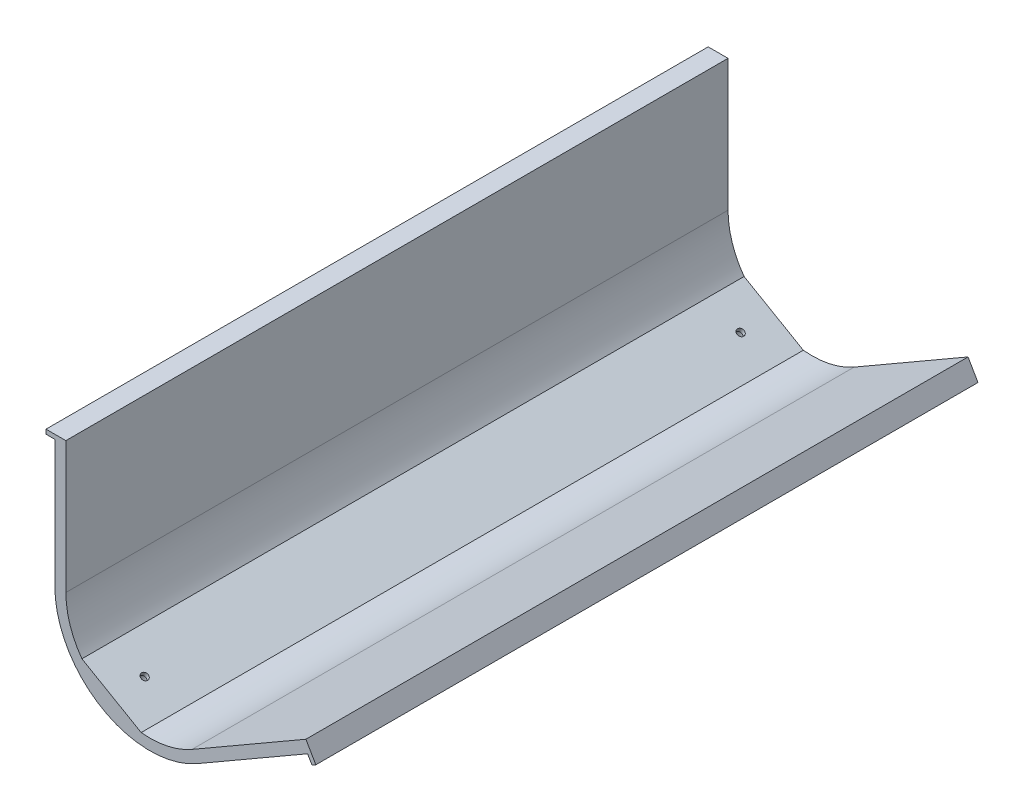
ISO-10303-21;
HEADER;
FILE_DESCRIPTION(('STEP AP214'),'2;1');
FILE_NAME('part.step','',(''),(''),'','','');
FILE_SCHEMA(('AUTOMOTIVE_DESIGN { 1 0 10303 214 1 1 1 1 }'));
ENDSEC;
DATA;
#1=APPLICATION_CONTEXT('core data for automotive mechanical design processes');
#2=APPLICATION_PROTOCOL_DEFINITION('international standard','automotive_design',2000,#1);
#3=PRODUCT_CONTEXT('',#1,'mechanical');
#4=PRODUCT('Part','Part','',(#3));
#5=PRODUCT_RELATED_PRODUCT_CATEGORY('part','',(#4));
#6=PRODUCT_DEFINITION_FORMATION('','',#4);
#7=PRODUCT_DEFINITION_CONTEXT('part definition',#1,'design');
#8=PRODUCT_DEFINITION('design','',#6,#7);
#9=PRODUCT_DEFINITION_SHAPE('','',#8);
#10=(LENGTH_UNIT() NAMED_UNIT(*) SI_UNIT(.MILLI.,.METRE.));
#11=(NAMED_UNIT(*) PLANE_ANGLE_UNIT() SI_UNIT($,.RADIAN.));
#12=(NAMED_UNIT(*) SI_UNIT($,.STERADIAN.) SOLID_ANGLE_UNIT());
#13=UNCERTAINTY_MEASURE_WITH_UNIT(LENGTH_MEASURE(1.E-05),#10,'distance_accuracy_value','');
#14=(GEOMETRIC_REPRESENTATION_CONTEXT(3) GLOBAL_UNCERTAINTY_ASSIGNED_CONTEXT((#13)) GLOBAL_UNIT_ASSIGNED_CONTEXT((#10,
#11,#12)) REPRESENTATION_CONTEXT('',''));
#15=CARTESIAN_POINT('',(0.,0.,0.));
#16=DIRECTION('',(0.,0.,1.));
#17=DIRECTION('',(1.,0.,0.));
#18=AXIS2_PLACEMENT_3D('',#15,#16,#17);
#19=CARTESIAN_POINT('',(33.0940107675842,0.,459.654933865598));
#20=DIRECTION('',(0.,0.,-1.));
#21=DIRECTION('',(-1.,0.,0.));
#22=AXIS2_PLACEMENT_3D('',#19,#20,#21);
#23=CYLINDRICAL_SURFACE('',#22,43.0940107675849);
#24=CARTESIAN_POINT('',(9.10518694657025,-35.799861671815,285.));
#25=CARTESIAN_POINT('',(9.10519244447353,-35.7998663266525,285.161297097093));
#26=CARTESIAN_POINT('',(9.11652316812617,-35.8074659248552,285.32270657392));
#27=CARTESIAN_POINT('',(9.16159802631115,-35.8376072181925,285.641066985922));
#28=CARTESIAN_POINT('',(9.19536812511742,-35.8601662225764,285.798012536322));
#29=CARTESIAN_POINT('',(9.28445875797792,-35.9193797442514,286.102787623212));
#30=CARTESIAN_POINT('',(9.33976776572867,-35.9560267223882,286.250621986524));
#31=CARTESIAN_POINT('',(9.47051911939522,-36.0420657217431,286.533038598448));
#32=CARTESIAN_POINT('',(9.54595691016941,-36.0914548593282,286.667623835914));
#33=CARTESIAN_POINT('',(9.71517680704267,-36.2012989670421,286.919987804878));
#34=CARTESIAN_POINT('',(9.80898618631744,-36.2617703804664,287.037741093674));
#35=CARTESIAN_POINT('',(10.0124622146195,-36.3916256307078,287.252880651108));
#36=CARTESIAN_POINT('',(10.1221295302732,-36.461009842182,287.350266063111));
#37=CARTESIAN_POINT('',(10.3545529188578,-36.6064147399901,287.521984909403));
#38=CARTESIAN_POINT('',(10.4773209078901,-36.6824414566216,287.596297112449));
#39=CARTESIAN_POINT('',(10.7325708372993,-36.838595646703,287.719624183307));
#40=CARTESIAN_POINT('',(10.8650526618639,-36.9187230712592,287.768639352663));
#41=CARTESIAN_POINT('',(11.1358908755815,-37.0804471556159,287.839909905808));
#42=CARTESIAN_POINT('',(11.2742381381263,-37.1620414267307,287.862205389749));
#43=CARTESIAN_POINT('',(11.5531171456246,-37.3243847083736,287.879527544094));
#44=CARTESIAN_POINT('',(11.6936488630598,-37.4051337295281,287.874554557732));
#45=CARTESIAN_POINT('',(11.9726571680676,-37.5633847751024,287.837513961301));
#46=CARTESIAN_POINT('',(12.1111366703706,-37.6408917624794,287.805489483915));
#47=CARTESIAN_POINT('',(12.3822568887193,-37.790753149233,287.715321921167));
#48=CARTESIAN_POINT('',(12.5148975664079,-37.8631075147624,287.657178664252));
#49=CARTESIAN_POINT('',(12.770543071781,-38.0009414950658,287.516375312336));
#50=CARTESIAN_POINT('',(12.8935401343535,-38.0664155839331,287.433695711658));
#51=CARTESIAN_POINT('',(13.1261155043288,-38.1889280804036,287.246180826693));
#52=CARTESIAN_POINT('',(13.2356936389436,-38.245966379386,287.141345257165));
#53=CARTESIAN_POINT('',(13.4383180949122,-38.3504962395822,286.912250817473));
#54=CARTESIAN_POINT('',(13.5313317908603,-38.3979689840718,286.787954502241));
#55=CARTESIAN_POINT('',(13.6977027205264,-38.4822780645245,286.523597950881));
#56=CARTESIAN_POINT('',(13.7710599451993,-38.5191143955932,286.383537707497));
#57=CARTESIAN_POINT('',(13.8958314683849,-38.5814536328349,286.091604706992));
#58=CARTESIAN_POINT('',(13.947244297232,-38.6069557799368,285.939731159511));
#59=CARTESIAN_POINT('',(14.0264906761579,-38.6461565118039,285.628493952112));
#60=CARTESIAN_POINT('',(14.0543245425335,-38.6598552549044,285.469130392698));
#61=CARTESIAN_POINT('',(14.0854935222108,-38.6751902858889,285.147765620562));
#62=CARTESIAN_POINT('',(14.088875733929,-38.67684976365,284.98577008139));
#63=CARTESIAN_POINT('',(14.0711577931146,-38.6681383367068,284.663450885273));
#64=CARTESIAN_POINT('',(14.0500577860039,-38.6577675034614,284.503127218403));
#65=CARTESIAN_POINT('',(13.984079768996,-38.6251943536176,284.188851302327));
#66=CARTESIAN_POINT('',(13.9392234513303,-38.603002830556,284.034893378508));
#67=CARTESIAN_POINT('',(13.8271632725371,-38.5471950603565,283.737543984934));
#68=CARTESIAN_POINT('',(13.7599591805395,-38.513578695191,283.59415262436));
#69=CARTESIAN_POINT('',(13.6051804337481,-38.435488196064,283.321766254255));
#70=CARTESIAN_POINT('',(13.5175748194409,-38.3909975551453,283.192793569926));
#71=CARTESIAN_POINT('',(13.3247482749117,-38.2920583983756,282.953130642489));
#72=CARTESIAN_POINT('',(13.21952714891,-38.2376097718503,282.842440602601));
#73=CARTESIAN_POINT('',(12.9944859369292,-38.1197978883274,282.642307773289));
#74=CARTESIAN_POINT('',(12.8746429974715,-38.0564206516239,282.552898906233));
#75=CARTESIAN_POINT('',(12.6240935984965,-37.9222417957547,282.398098649762));
#76=CARTESIAN_POINT('',(12.4933872135474,-37.8514402275497,282.332707095504));
#77=CARTESIAN_POINT('',(12.2251004680357,-37.704187082144,282.227856563488));
#78=CARTESIAN_POINT('',(12.0875258759193,-37.6277402212668,282.188376205066));
#79=CARTESIAN_POINT('',(11.8094260598235,-37.4711311969166,282.136398812612));
#80=CARTESIAN_POINT('',(11.6689008696931,-37.390969076052,282.123901469203));
#81=CARTESIAN_POINT('',(11.3892147817137,-37.2293115097064,282.126247952406));
#82=CARTESIAN_POINT('',(11.2500517644559,-37.1478189557116,282.141038732099));
#83=CARTESIAN_POINT('',(10.9767234348156,-36.9857353685124,282.197431503953));
#84=CARTESIAN_POINT('',(10.8425581309257,-36.9051443368402,282.239033541672));
#85=CARTESIAN_POINT('',(10.5829137161413,-36.7473451089797,282.347855622046));
#86=CARTESIAN_POINT('',(10.4574344813431,-36.6701368645429,282.415075299187));
#87=CARTESIAN_POINT('',(10.2185290308157,-36.5215814556957,282.573217511789));
#88=CARTESIAN_POINT('',(10.1051025246018,-36.4502341500393,282.664139475816));
#89=CARTESIAN_POINT('',(9.89308124331671,-36.3156503243752,282.867302345702));
#90=CARTESIAN_POINT('',(9.79451391062923,-36.2524288423668,282.979581851251));
#91=CARTESIAN_POINT('',(9.61498881558282,-36.1364186011862,283.222215969229));
#92=CARTESIAN_POINT('',(9.5340353602606,-36.0836323939894,283.352574989824));
#93=CARTESIAN_POINT('',(9.39174688472133,-35.9903281847304,283.627835036746));
#94=CARTESIAN_POINT('',(9.33043853945913,-35.9498268675561,283.772755487625));
#95=CARTESIAN_POINT('',(9.22920909909171,-35.8827079355814,284.072779367351));
#96=CARTESIAN_POINT('',(9.18926303646849,-35.8560741138832,284.227870669685));
#97=CARTESIAN_POINT('',(9.14210261175095,-35.8245769595269,284.48658744668));
#98=CARTESIAN_POINT('',(9.12827546427715,-35.8153238252842,284.588541978836));
#99=CARTESIAN_POINT('',(9.10981588029737,-35.8029646972843,284.793649007773));
#100=CARTESIAN_POINT('',(9.10518342899079,-35.7998586936321,284.896801502625));
#101=CARTESIAN_POINT('',(9.10518694657025,-35.799861671815,285.));
#102=B_SPLINE_CURVE_WITH_KNOTS('',3,(#24,#25,#26,#27,#28,#29,#30,#31,#32,#33,#34,#35,#36,#37,
#38,#39,#40,#41,#42,#43,#44,#45,#46,#47,#48,#49,#50,#51,#52,#53,#54,#55,#56,#57,#58,#59,#60,#61,
#62,#63,#64,#65,#66,#67,#68,#69,#70,#71,#72,#73,#74,#75,#76,#77,#78,#79,#80,#81,#82,#83,#84,#85,
#86,#87,#88,#89,#90,#91,#92,#93,#94,#95,#96,#97,#98,#99,#100,#101),.UNSPECIFIED.,.T.,.F.,(4,2,2,
2,2,2,2,2,2,2,2,2,2,2,2,2,2,2,2,2,2,2,2,2,2,2,2,2,2,2,2,2,2,2,2,2,2,2,4),(0.,0.483514542357615,
0.967589528847677,1.45140582327215,1.935112722839,2.41954321885344,2.90399408498874,
3.38888941544184,3.87377896570989,4.3579398924167,4.84209472492526,5.32547904302915,
5.80886653616381,6.29263934239359,6.77641837723653,7.26113997387421,7.74586179356263,
8.23061607107052,8.71536384580417,9.19917765713678,9.68298859467953,10.1663585171958,
10.6497334334575,11.1338467116872,11.6179653707357,12.1028506270876,12.5877325553981,
13.0722138779189,13.556689645543,14.0402246056368,14.5237603873553,15.0072892701854,
15.4908064967615,15.9752060374027,16.4597238931478,16.9448968867766,17.4295015802977,
17.7388565249918,18.0482109717202),.UNSPECIFIED.);
#103=CARTESIAN_POINT('',(9.10518694657025,-35.799861671815,285.));
#104=VERTEX_POINT('',#103);
#105=EDGE_CURVE('E37',#104,#104,#102,.T.);
#106=ORIENTED_EDGE('',*,*,#105,.T.);
#107=EDGE_LOOP('',(#106));
#108=FACE_BOUND('',#107,.T.);
#109=CARTESIAN_POINT('',(9.10518694657026,-35.799861671815,15.));
#110=CARTESIAN_POINT('',(9.10519244447353,-35.7998663266525,15.1612970970931));
#111=CARTESIAN_POINT('',(9.11652316812617,-35.8074659248552,15.3227065739202));
#112=CARTESIAN_POINT('',(9.16159802631115,-35.8376072181925,15.6410669859224));
#113=CARTESIAN_POINT('',(9.19536812511742,-35.8601662225764,15.7980125363219));
#114=CARTESIAN_POINT('',(9.28445875797792,-35.9193797442514,16.1027876232124));
#115=CARTESIAN_POINT('',(9.33976776572868,-35.9560267223882,16.2506219865244));
#116=CARTESIAN_POINT('',(9.47051911939522,-36.0420657217431,16.5330385984478));
#117=CARTESIAN_POINT('',(9.5459569101694,-36.0914548593282,16.6676238359136));
#118=CARTESIAN_POINT('',(9.71517680704266,-36.2012989670421,16.919987804878));
#119=CARTESIAN_POINT('',(9.80898618631743,-36.2617703804664,17.0377410936741));
#120=CARTESIAN_POINT('',(10.0124622146195,-36.3916256307078,17.2528806511076));
#121=CARTESIAN_POINT('',(10.1221295302732,-36.461009842182,17.3502660631113));
#122=CARTESIAN_POINT('',(10.3545529188578,-36.6064147399901,17.5219849094027));
#123=CARTESIAN_POINT('',(10.47732090789,-36.6824414566216,17.5962971124491));
#124=CARTESIAN_POINT('',(10.7325708372993,-36.8385956467031,17.7196241833065));
#125=CARTESIAN_POINT('',(10.865052661864,-36.9187230712592,17.7686393526634));
#126=CARTESIAN_POINT('',(11.1358908755815,-37.0804471556159,17.8399099058084));
#127=CARTESIAN_POINT('',(11.2742381381263,-37.1620414267307,17.862205389749));
#128=CARTESIAN_POINT('',(11.5531171456246,-37.3243847083736,17.8795275440942));
#129=CARTESIAN_POINT('',(11.6936488630598,-37.4051337295281,17.8745545577315));
#130=CARTESIAN_POINT('',(11.9726571680676,-37.5633847751024,17.8375139613011));
#131=CARTESIAN_POINT('',(12.1111366703706,-37.6408917624794,17.8054894839145));
#132=CARTESIAN_POINT('',(12.3822568887194,-37.790753149233,17.715321921167));
#133=CARTESIAN_POINT('',(12.5148975664079,-37.8631075147624,17.6571786642518));
#134=CARTESIAN_POINT('',(12.770543071781,-38.0009414950658,17.5163753123363));
#135=CARTESIAN_POINT('',(12.8935401343535,-38.0664155839331,17.4336957116579));
#136=CARTESIAN_POINT('',(13.1261155043288,-38.1889280804036,17.2461808266934));
#137=CARTESIAN_POINT('',(13.2356936389436,-38.245966379386,17.1413452571648));
#138=CARTESIAN_POINT('',(13.4383180949122,-38.3504962395822,16.9122508174725));
#139=CARTESIAN_POINT('',(13.5313317908603,-38.3979689840718,16.7879545022411));
#140=CARTESIAN_POINT('',(13.6977027205264,-38.4822780645245,16.5235979508806));
#141=CARTESIAN_POINT('',(13.7710599451993,-38.5191143955932,16.3835377074974));
#142=CARTESIAN_POINT('',(13.8958314683849,-38.5814536328349,16.0916047069917));
#143=CARTESIAN_POINT('',(13.947244297232,-38.6069557799368,15.9397311595107));
#144=CARTESIAN_POINT('',(14.0264906761579,-38.6461565118039,15.6284939521119));
#145=CARTESIAN_POINT('',(14.0543245425336,-38.6598552549044,15.4691303926981));
#146=CARTESIAN_POINT('',(14.0854935222109,-38.6751902858889,15.1477656205615));
#147=CARTESIAN_POINT('',(14.088875733929,-38.67684976365,14.9857700813894));
#148=CARTESIAN_POINT('',(14.0711577931146,-38.6681383367068,14.6634508852726));
#149=CARTESIAN_POINT('',(14.0500577860039,-38.6577675034614,14.5031272184029));
#150=CARTESIAN_POINT('',(13.984079768996,-38.6251943536176,14.1888513023271));
#151=CARTESIAN_POINT('',(13.9392234513303,-38.603002830556,14.0348933785076));
#152=CARTESIAN_POINT('',(13.8271632725371,-38.5471950603565,13.7375439849343));
#153=CARTESIAN_POINT('',(13.7599591805396,-38.513578695191,13.5941526243602));
#154=CARTESIAN_POINT('',(13.6051804337481,-38.435488196064,13.3217662542546));
#155=CARTESIAN_POINT('',(13.5175748194409,-38.3909975551453,13.1927935699264));
#156=CARTESIAN_POINT('',(13.3247482749118,-38.2920583983756,12.9531306424889));
#157=CARTESIAN_POINT('',(13.21952714891,-38.2376097718503,12.842440602601));
#158=CARTESIAN_POINT('',(12.9944859369292,-38.1197978883274,12.6423077732891));
#159=CARTESIAN_POINT('',(12.8746429974715,-38.0564206516239,12.5528989062334));
#160=CARTESIAN_POINT('',(12.6240935984965,-37.9222417957547,12.3980986497617));
#161=CARTESIAN_POINT('',(12.4933872135474,-37.8514402275497,12.3327070955044));
#162=CARTESIAN_POINT('',(12.2251004680357,-37.704187082144,12.2278565634881));
#163=CARTESIAN_POINT('',(12.0875258759193,-37.6277402212668,12.188376205066));
#164=CARTESIAN_POINT('',(11.8094260598235,-37.4711311969166,12.1363988126115));
#165=CARTESIAN_POINT('',(11.6689008696931,-37.390969076052,12.1239014692027));
#166=CARTESIAN_POINT('',(11.3892147817138,-37.2293115097064,12.1262479524056));
#167=CARTESIAN_POINT('',(11.2500517644559,-37.1478189557116,12.1410387320989));
#168=CARTESIAN_POINT('',(10.9767234348156,-36.9857353685124,12.1974315039533));
#169=CARTESIAN_POINT('',(10.8425581309257,-36.9051443368402,12.239033541672));
#170=CARTESIAN_POINT('',(10.5829137161413,-36.7473451089797,12.3478556220465));
#171=CARTESIAN_POINT('',(10.4574344813431,-36.6701368645429,12.4150752991866));
#172=CARTESIAN_POINT('',(10.2185290308158,-36.5215814556957,12.5732175117887));
#173=CARTESIAN_POINT('',(10.1051025246018,-36.4502341500393,12.6641394758155));
#174=CARTESIAN_POINT('',(9.89308124331672,-36.3156503243752,12.8673023457015));
#175=CARTESIAN_POINT('',(9.79451391062925,-36.2524288423668,12.9795818512506));
#176=CARTESIAN_POINT('',(9.61498881558284,-36.1364186011862,13.2222159692288));
#177=CARTESIAN_POINT('',(9.53403536026061,-36.0836323939894,13.3525749898236));
#178=CARTESIAN_POINT('',(9.39174688472133,-35.9903281847304,13.6278350367465));
#179=CARTESIAN_POINT('',(9.33043853945913,-35.9498268675561,13.7727554876249));
#180=CARTESIAN_POINT('',(9.22920909909171,-35.8827079355814,14.0727793673509));
#181=CARTESIAN_POINT('',(9.1892630364685,-35.8560741138833,14.2278706696853));
#182=CARTESIAN_POINT('',(9.14210261175095,-35.8245769595269,14.4865874466799));
#183=CARTESIAN_POINT('',(9.12827546427715,-35.8153238252842,14.5885419788358));
#184=CARTESIAN_POINT('',(9.10981588029738,-35.8029646972843,14.7936490077728));
#185=CARTESIAN_POINT('',(9.1051834289908,-35.7998586936321,14.8968015026252));
#186=CARTESIAN_POINT('',(9.10518694657026,-35.799861671815,15.));
#187=B_SPLINE_CURVE_WITH_KNOTS('',3,(#109,#110,#111,#112,#113,#114,#115,#116,#117,#118,#119,
#120,#121,#122,#123,#124,#125,#126,#127,#128,#129,#130,#131,#132,#133,#134,#135,#136,#137,#138,
#139,#140,#141,#142,#143,#144,#145,#146,#147,#148,#149,#150,#151,#152,#153,#154,#155,#156,#157,
#158,#159,#160,#161,#162,#163,#164,#165,#166,#167,#168,#169,#170,#171,#172,#173,#174,#175,#176,
#177,#178,#179,#180,#181,#182,#183,#184,#185,#186),.UNSPECIFIED.,.T.,.F.,(4,2,2,2,2,2,2,2,2,2,2,
2,2,2,2,2,2,2,2,2,2,2,2,2,2,2,2,2,2,2,2,2,2,2,2,2,2,2,4),(0.,0.483514542357623,
0.967589528847684,1.45140582327213,1.935112722839,2.41954321885344,2.90399408498871,
3.38888941544184,3.8737789657099,4.35793989241672,4.84209472492527,5.32547904302916,
5.80886653616383,6.29263934239359,6.77641837723654,7.26113997387425,7.74586179356267,
8.23061607107055,8.71536384580422,9.1991776571369,9.68298859467958,10.1663585171957,
10.6497334334575,11.1338467116872,11.6179653707357,12.1028506270876,12.5877325553981,
13.0722138779189,13.556689645543,14.0402246056368,14.5237603873553,15.0072892701854,
15.4908064967616,15.9752060374027,16.4597238931479,16.9448968867766,17.4295015802977,
17.7388565249918,18.0482109717202),.UNSPECIFIED.);
#188=CARTESIAN_POINT('',(9.10518694657026,-35.799861671815,15.));
#189=VERTEX_POINT('',#188);
#190=EDGE_CURVE('E234',#189,#189,#187,.T.);
#191=ORIENTED_EDGE('',*,*,#190,.T.);
#192=EDGE_LOOP('',(#191));
#193=FACE_BOUND('',#192,.T.);
#194=CARTESIAN_POINT('',(33.0940107675842,0.,300.));
#195=DIRECTION('',(0.,0.,1.));
#196=DIRECTION('',(1.,0.,0.));
#197=AXIS2_PLACEMENT_3D('',#194,#195,#196);
#198=CIRCLE('',#197,43.0940107675849);
#199=CARTESIAN_POINT('',(-10.0000000000007,0.,300.));
#200=VERTEX_POINT('',#199);
#201=CARTESIAN_POINT('',(54.6410161513771,-37.3205080756885,300.));
#202=VERTEX_POINT('',#201);
#203=EDGE_CURVE('E190',#200,#202,#198,.T.);
#204=ORIENTED_EDGE('',*,*,#203,.F.);
#205=DIRECTION('',(0.,0.,-1.));
#206=VECTOR('',#205,1.);
#207=CARTESIAN_POINT('',(-10.0000000000007,0.,459.654933865598));
#208=LINE('',#207,#206);
#209=CARTESIAN_POINT('',(-10.0000000000007,0.,0.));
#210=VERTEX_POINT('',#209);
#211=EDGE_CURVE('E53',#200,#210,#208,.T.);
#212=ORIENTED_EDGE('',*,*,#211,.T.);
#213=CARTESIAN_POINT('',(33.0940107675842,0.,0.));
#214=DIRECTION('',(0.,0.,1.));
#215=DIRECTION('',(1.,0.,0.));
#216=AXIS2_PLACEMENT_3D('',#213,#214,#215);
#217=CIRCLE('',#216,43.0940107675849);
#218=CARTESIAN_POINT('',(54.6410161513771,-37.3205080756885,0.));
#219=VERTEX_POINT('',#218);
#220=EDGE_CURVE('E198',#210,#219,#217,.T.);
#221=ORIENTED_EDGE('',*,*,#220,.T.);
#222=DIRECTION('',(0.,0.,-1.));
#223=VECTOR('',#222,1.);
#224=CARTESIAN_POINT('',(54.6410161513771,-37.3205080756885,459.654933865598));
#225=LINE('',#224,#223);
#226=EDGE_CURVE('E116',#202,#219,#225,.T.);
#227=ORIENTED_EDGE('',*,*,#226,.F.);
#228=EDGE_LOOP('',(#204,#212,#221,#227));
#229=FACE_BOUND('',#228,.T.);
#230=ADVANCED_FACE('F33',(#108,#193,#229),#23,.T.);
#231=CARTESIAN_POINT('',(54.6410161513771,-37.3205080756885,459.654933865598));
#232=DIRECTION('',(-0.500000000000016,0.866025403784429,0.));
#233=DIRECTION('',(-0.866025403784429,-0.500000000000016,0.));
#234=AXIS2_PLACEMENT_3D('',#231,#232,#233);
#235=PLANE('',#234);
#236=DIRECTION('',(0.866025403784429,0.500000000000016,0.));
#237=VECTOR('',#236,1.);
#238=CARTESIAN_POINT('',(54.6410161513771,-37.3205080756885,300.));
#239=LINE('',#238,#237);
#240=CARTESIAN_POINT('',(104.518010155129,-8.52401216125157,300.));
#241=VERTEX_POINT('',#240);
#242=EDGE_CURVE('E123',#202,#241,#239,.T.);
#243=ORIENTED_EDGE('',*,*,#242,.F.);
#244=ORIENTED_EDGE('',*,*,#226,.T.);
#245=DIRECTION('',(0.866025403784429,0.500000000000016,0.));
#246=VECTOR('',#245,1.);
#247=CARTESIAN_POINT('',(54.6410161513771,-37.3205080756885,0.));
#248=LINE('',#247,#246);
#249=CARTESIAN_POINT('',(104.518010155129,-8.52401216125157,0.));
#250=VERTEX_POINT('',#249);
#251=EDGE_CURVE('E197',#219,#250,#248,.T.);
#252=ORIENTED_EDGE('',*,*,#251,.T.);
#253=DIRECTION('',(0.,0.,-1.));
#254=VECTOR('',#253,1.);
#255=CARTESIAN_POINT('',(104.518010155129,-8.52401216125157,459.654933865598));
#256=LINE('',#255,#254);
#257=EDGE_CURVE('E199',#241,#250,#256,.T.);
#258=ORIENTED_EDGE('',*,*,#257,.F.);
#259=EDGE_LOOP('',(#243,#244,#252,#258));
#260=FACE_BOUND('',#259,.T.);
#261=ADVANCED_FACE('F304',(#260),#235,.F.);
#262=CARTESIAN_POINT('',(104.518010155129,-8.52401216125157,459.654933865598));
#263=DIRECTION('',(0.86602540378443,0.500000000000015,0.));
#264=DIRECTION('',(-0.500000000000015,0.86602540378443,0.));
#265=AXIS2_PLACEMENT_3D('',#262,#263,#264);
#266=PLANE('',#265);
#267=DIRECTION('',(0.500000000000015,-0.86602540378443,0.));
#268=VECTOR('',#267,1.);
#269=CARTESIAN_POINT('',(104.518010155129,-8.52401216125157,300.));
#270=LINE('',#269,#268);
#271=CARTESIAN_POINT('',(106.518010155129,-11.9881137763893,300.));
#272=VERTEX_POINT('',#271);
#273=EDGE_CURVE('E186',#241,#272,#270,.T.);
#274=ORIENTED_EDGE('',*,*,#273,.F.);
#275=ORIENTED_EDGE('',*,*,#257,.T.);
#276=DIRECTION('',(0.500000000000015,-0.86602540378443,0.));
#277=VECTOR('',#276,1.);
#278=CARTESIAN_POINT('',(104.518010155129,-8.52401216125157,0.));
#279=LINE('',#278,#277);
#280=CARTESIAN_POINT('',(106.518010155129,-11.9881137763893,0.));
#281=VERTEX_POINT('',#280);
#282=EDGE_CURVE('E201',#250,#281,#279,.T.);
#283=ORIENTED_EDGE('',*,*,#282,.T.);
#284=DIRECTION('',(0.,0.,-1.));
#285=VECTOR('',#284,1.);
#286=CARTESIAN_POINT('',(106.518010155129,-11.9881137763893,459.654933865598));
#287=LINE('',#286,#285);
#288=EDGE_CURVE('E202',#272,#281,#287,.T.);
#289=ORIENTED_EDGE('',*,*,#288,.F.);
#290=EDGE_LOOP('',(#274,#275,#283,#289));
#291=FACE_BOUND('',#290,.T.);
#292=ADVANCED_FACE('F301',(#291),#266,.F.);
#293=CARTESIAN_POINT('',(106.518010155129,-11.9881137763893,459.654933865598));
#294=DIRECTION('',(-0.500000000000012,0.866025403784432,0.));
#295=DIRECTION('',(-0.866025403784432,-0.500000000000012,0.));
#296=AXIS2_PLACEMENT_3D('',#293,#294,#295);
#297=PLANE('',#296);
#298=DIRECTION('',(0.866025403784432,0.500000000000012,0.));
#299=VECTOR('',#298,1.);
#300=CARTESIAN_POINT('',(106.518010155129,-11.9881137763893,300.));
#301=LINE('',#300,#299);
#302=CARTESIAN_POINT('',(108.250060962698,-10.9881137763893,300.));
#303=VERTEX_POINT('',#302);
#304=EDGE_CURVE('E183',#272,#303,#301,.T.);
#305=ORIENTED_EDGE('',*,*,#304,.F.);
#306=ORIENTED_EDGE('',*,*,#288,.T.);
#307=DIRECTION('',(0.866025403784432,0.500000000000012,0.));
#308=VECTOR('',#307,1.);
#309=CARTESIAN_POINT('',(106.518010155129,-11.9881137763893,0.));
#310=LINE('',#309,#308);
#311=CARTESIAN_POINT('',(108.250060962698,-10.9881137763893,0.));
#312=VERTEX_POINT('',#311);
#313=EDGE_CURVE('E204',#281,#312,#310,.T.);
#314=ORIENTED_EDGE('',*,*,#313,.T.);
#315=DIRECTION('',(0.,0.,-1.));
#316=VECTOR('',#315,1.);
#317=CARTESIAN_POINT('',(108.250060962698,-10.9881137763893,459.654933865598));
#318=LINE('',#317,#316);
#319=EDGE_CURVE('E205',#303,#312,#318,.T.);
#320=ORIENTED_EDGE('',*,*,#319,.F.);
#321=EDGE_LOOP('',(#305,#306,#314,#320));
#322=FACE_BOUND('',#321,.T.);
#323=ADVANCED_FACE('F297',(#322),#297,.F.);
#324=CARTESIAN_POINT('',(106.250060962698,-7.52401216125177,459.654933865598));
#325=DIRECTION('',(-0.866025403784432,-0.500000000000011,0.));
#326=DIRECTION('',(0.500000000000011,-0.866025403784432,0.));
#327=AXIS2_PLACEMENT_3D('',#324,#325,#326);
#328=PLANE('',#327);
#329=DIRECTION('',(-0.500000000000011,0.866025403784432,0.));
#330=VECTOR('',#329,1.);
#331=CARTESIAN_POINT('',(106.250060962698,-7.52401216125177,300.));
#332=LINE('',#331,#330);
#333=CARTESIAN_POINT('',(103.750060962698,-3.19388514232939,300.));
#334=VERTEX_POINT('',#333);
#335=EDGE_CURVE('E180',#303,#334,#332,.T.);
#336=ORIENTED_EDGE('',*,*,#335,.F.);
#337=ORIENTED_EDGE('',*,*,#319,.T.);
#338=DIRECTION('',(-0.500000000000011,0.866025403784432,0.));
#339=VECTOR('',#338,1.);
#340=CARTESIAN_POINT('',(106.250060962698,-7.52401216125177,0.));
#341=LINE('',#340,#339);
#342=CARTESIAN_POINT('',(103.750060962698,-3.19388514232939,0.));
#343=VERTEX_POINT('',#342);
#344=EDGE_CURVE('E207',#312,#343,#341,.T.);
#345=ORIENTED_EDGE('',*,*,#344,.T.);
#346=DIRECTION('',(0.,0.,-1.));
#347=VECTOR('',#346,1.);
#348=CARTESIAN_POINT('',(103.750060962698,-3.19388514232939,459.654933865598));
#349=LINE('',#348,#347);
#350=EDGE_CURVE('E208',#334,#343,#349,.T.);
#351=ORIENTED_EDGE('',*,*,#350,.F.);
#352=EDGE_LOOP('',(#336,#337,#345,#351));
#353=FACE_BOUND('',#352,.T.);
#354=ADVANCED_FACE('F293',(#353),#328,.F.);
#355=CARTESIAN_POINT('',(52.1410161513771,-32.9903810567663,459.654933865598));
#356=DIRECTION('',(0.500000000000015,-0.86602540378443,0.));
#357=DIRECTION('',(0.86602540378443,0.500000000000015,0.));
#358=AXIS2_PLACEMENT_3D('',#355,#356,#357);
#359=PLANE('',#358);
#360=DIRECTION('',(-0.86602540378443,-0.500000000000015,0.));
#361=VECTOR('',#360,1.);
#362=CARTESIAN_POINT('',(52.1410161513771,-32.9903810567663,300.));
#363=LINE('',#362,#361);
#364=CARTESIAN_POINT('',(52.1410161513771,-32.9903810567663,300.));
#365=VERTEX_POINT('',#364);
#366=EDGE_CURVE('E177',#334,#365,#363,.T.);
#367=ORIENTED_EDGE('',*,*,#366,.F.);
#368=ORIENTED_EDGE('',*,*,#350,.T.);
#369=DIRECTION('',(-0.86602540378443,-0.500000000000015,0.));
#370=VECTOR('',#369,1.);
#371=CARTESIAN_POINT('',(52.1410161513771,-32.9903810567663,0.));
#372=LINE('',#371,#370);
#373=CARTESIAN_POINT('',(52.1410161513771,-32.9903810567663,0.));
#374=VERTEX_POINT('',#373);
#375=EDGE_CURVE('E210',#343,#374,#372,.T.);
#376=ORIENTED_EDGE('',*,*,#375,.T.);
#377=DIRECTION('',(0.,0.,-1.));
#378=VECTOR('',#377,1.);
#379=CARTESIAN_POINT('',(52.1410161513771,-32.9903810567663,459.654933865598));
#380=LINE('',#379,#378);
#381=EDGE_CURVE('E211',#365,#374,#380,.T.);
#382=ORIENTED_EDGE('',*,*,#381,.F.);
#383=EDGE_LOOP('',(#367,#368,#376,#382));
#384=FACE_BOUND('',#383,.T.);
#385=ADVANCED_FACE('F289',(#384),#359,.F.);
#386=CARTESIAN_POINT('',(33.0940107675842,0.,459.654933865598));
#387=DIRECTION('',(0.,0.,-1.));
#388=DIRECTION('',(-1.,0.,0.));
#389=AXIS2_PLACEMENT_3D('',#386,#387,#388);
#390=CYLINDRICAL_SURFACE('',#389,38.0940107675849);
#391=CARTESIAN_POINT('',(33.0940107675842,0.,300.));
#392=DIRECTION('',(0.,0.,1.));
#393=DIRECTION('',(1.,0.,0.));
#394=AXIS2_PLACEMENT_3D('',#391,#392,#393);
#395=CIRCLE('',#394,38.0940107675849);
#396=CARTESIAN_POINT('',(29.1209151276498,-37.8862530134192,300.));
#397=VERTEX_POINT('',#396);
#398=EDGE_CURVE('E174',#365,#397,#395,.F.);
#399=ORIENTED_EDGE('',*,*,#398,.F.);
#400=ORIENTED_EDGE('',*,*,#381,.T.);
#401=CARTESIAN_POINT('',(33.0940107675842,0.,0.));
#402=DIRECTION('',(0.,0.,-1.));
#403=DIRECTION('',(1.,0.,0.));
#404=AXIS2_PLACEMENT_3D('',#401,#402,#403);
#405=CIRCLE('',#404,38.0940107675849);
#406=CARTESIAN_POINT('',(29.1209151276498,-37.8862530134192,0.));
#407=VERTEX_POINT('',#406);
#408=EDGE_CURVE('E213',#374,#407,#405,.T.);
#409=ORIENTED_EDGE('',*,*,#408,.T.);
#410=DIRECTION('',(0.,0.,-1.));
#411=VECTOR('',#410,1.);
#412=CARTESIAN_POINT('',(29.1209151276498,-37.8862530134192,459.654933865598));
#413=LINE('',#412,#411);
#414=EDGE_CURVE('E214',#397,#407,#413,.T.);
#415=ORIENTED_EDGE('',*,*,#414,.F.);
#416=EDGE_LOOP('',(#399,#400,#409,#415));
#417=FACE_BOUND('',#416,.T.);
#418=ADVANCED_FACE('F285',(#417),#390,.F.);
#419=CARTESIAN_POINT('',(2.27010102372575,-22.3839282625581,459.654933865598));
#420=DIRECTION('',(-0.499999999999999,-0.86602540378444,0.));
#421=DIRECTION('',(0.86602540378444,-0.499999999999999,0.));
#422=AXIS2_PLACEMENT_3D('',#419,#420,#421);
#423=PLANE('',#422);
#424=CARTESIAN_POINT('',(15.6955080756878,-30.1350906379887,285.));
#425=DIRECTION('',(0.499999999999999,0.866025403784439,0.));
#426=DIRECTION('',(0.866025403784439,-0.499999999999999,0.));
#427=AXIS2_PLACEMENT_3D('',#424,#425,#426);
#428=CIRCLE('',#427,1.60000000000001);
#429=CARTESIAN_POINT('',(17.0811487217429,-30.9350906379887,285.));
#430=VERTEX_POINT('',#429);
#431=EDGE_CURVE('E240',#430,#430,#428,.T.);
#432=ORIENTED_EDGE('',*,*,#431,.F.);
#433=EDGE_LOOP('',(#432));
#434=FACE_BOUND('',#433,.T.);
#435=CARTESIAN_POINT('',(15.6955080756878,-30.1350906379887,15.));
#436=DIRECTION('',(0.499999999999999,0.866025403784439,0.));
#437=DIRECTION('',(-0.866025403784439,0.499999999999999,0.));
#438=AXIS2_PLACEMENT_3D('',#435,#436,#437);
#439=CIRCLE('',#438,1.60000000000001);
#440=CARTESIAN_POINT('',(14.3098674296327,-29.3350906379887,15.));
#441=VERTEX_POINT('',#440);
#442=EDGE_CURVE('E230',#441,#441,#439,.T.);
#443=ORIENTED_EDGE('',*,*,#442,.F.);
#444=EDGE_LOOP('',(#443));
#445=FACE_BOUND('',#444,.T.);
#446=DIRECTION('',(-0.86602540378444,0.499999999999999,0.));
#447=VECTOR('',#446,1.);
#448=CARTESIAN_POINT('',(2.27010102372575,-22.3839282625581,300.));
#449=LINE('',#448,#447);
#450=CARTESIAN_POINT('',(2.27010102372574,-22.3839282625581,300.));
#451=VERTEX_POINT('',#450);
#452=EDGE_CURVE('E171',#397,#451,#449,.T.);
#453=ORIENTED_EDGE('',*,*,#452,.F.);
#454=ORIENTED_EDGE('',*,*,#414,.T.);
#455=DIRECTION('',(-0.86602540378444,0.499999999999999,0.));
#456=VECTOR('',#455,1.);
#457=CARTESIAN_POINT('',(2.27010102372575,-22.3839282625581,0.));
#458=LINE('',#457,#456);
#459=CARTESIAN_POINT('',(2.27010102372574,-22.3839282625581,0.));
#460=VERTEX_POINT('',#459);
#461=EDGE_CURVE('E216',#407,#460,#458,.T.);
#462=ORIENTED_EDGE('',*,*,#461,.T.);
#463=DIRECTION('',(0.,0.,-1.));
#464=VECTOR('',#463,1.);
#465=CARTESIAN_POINT('',(2.27010102372574,-22.3839282625581,459.654933865598));
#466=LINE('',#465,#464);
#467=EDGE_CURVE('E217',#451,#460,#466,.T.);
#468=ORIENTED_EDGE('',*,*,#467,.F.);
#469=EDGE_LOOP('',(#453,#454,#462,#468));
#470=FACE_BOUND('',#469,.T.);
#471=ADVANCED_FACE('F281',(#434,#445,#470),#423,.F.);
#472=CARTESIAN_POINT('',(33.0940107675842,0.,459.654933865598));
#473=DIRECTION('',(0.,0.,-1.));
#474=DIRECTION('',(-1.,0.,0.));
#475=AXIS2_PLACEMENT_3D('',#472,#473,#474);
#476=CYLINDRICAL_SURFACE('',#475,38.0940107675849);
#477=CARTESIAN_POINT('',(33.0940107675842,0.,300.));
#478=DIRECTION('',(0.,0.,1.));
#479=DIRECTION('',(1.,0.,0.));
#480=AXIS2_PLACEMENT_3D('',#477,#478,#479);
#481=CIRCLE('',#480,38.0940107675849);
#482=CARTESIAN_POINT('',(-5.00000000000073,0.,300.));
#483=VERTEX_POINT('',#482);
#484=EDGE_CURVE('E168',#451,#483,#481,.F.);
#485=ORIENTED_EDGE('',*,*,#484,.F.);
#486=ORIENTED_EDGE('',*,*,#467,.T.);
#487=CARTESIAN_POINT('',(33.0940107675842,0.,0.));
#488=DIRECTION('',(0.,0.,-1.));
#489=DIRECTION('',(1.,0.,0.));
#490=AXIS2_PLACEMENT_3D('',#487,#488,#489);
#491=CIRCLE('',#490,38.0940107675849);
#492=CARTESIAN_POINT('',(-5.00000000000073,0.,0.));
#493=VERTEX_POINT('',#492);
#494=EDGE_CURVE('E219',#460,#493,#491,.T.);
#495=ORIENTED_EDGE('',*,*,#494,.T.);
#496=DIRECTION('',(0.,0.,-1.));
#497=VECTOR('',#496,1.);
#498=CARTESIAN_POINT('',(-5.00000000000073,0.,459.654933865598));
#499=LINE('',#498,#497);
#500=EDGE_CURVE('E220',#483,#493,#499,.T.);
#501=ORIENTED_EDGE('',*,*,#500,.F.);
#502=EDGE_LOOP('',(#485,#486,#495,#501));
#503=FACE_BOUND('',#502,.T.);
#504=ADVANCED_FACE('F277',(#503),#476,.F.);
#505=CARTESIAN_POINT('',(-5.00000000000073,0.,459.654933865598));
#506=DIRECTION('',(-1.,0.,0.));
#507=DIRECTION('',(0.,-1.,0.));
#508=AXIS2_PLACEMENT_3D('',#505,#506,#507);
#509=PLANE('',#508);
#510=DIRECTION('',(0.,1.,0.));
#511=VECTOR('',#510,1.);
#512=CARTESIAN_POINT('',(-5.00000000000073,0.,300.));
#513=LINE('',#512,#511);
#514=CARTESIAN_POINT('',(-5.00000000000044,59.5929918288719,300.));
#515=VERTEX_POINT('',#514);
#516=EDGE_CURVE('E163',#483,#515,#513,.T.);
#517=ORIENTED_EDGE('',*,*,#516,.F.);
#518=ORIENTED_EDGE('',*,*,#500,.T.);
#519=DIRECTION('',(0.,1.,0.));
#520=VECTOR('',#519,1.);
#521=CARTESIAN_POINT('',(-5.00000000000073,0.,0.));
#522=LINE('',#521,#520);
#523=CARTESIAN_POINT('',(-5.00000000000044,59.5929918288719,0.));
#524=VERTEX_POINT('',#523);
#525=EDGE_CURVE('E222',#493,#524,#522,.T.);
#526=ORIENTED_EDGE('',*,*,#525,.T.);
#527=DIRECTION('',(0.,0.,-1.));
#528=VECTOR('',#527,1.);
#529=CARTESIAN_POINT('',(-5.00000000000044,59.5929918288719,459.654933865598));
#530=LINE('',#529,#528);
#531=EDGE_CURVE('E223',#515,#524,#530,.T.);
#532=ORIENTED_EDGE('',*,*,#531,.F.);
#533=EDGE_LOOP('',(#517,#518,#526,#532));
#534=FACE_BOUND('',#533,.T.);
#535=ADVANCED_FACE('F273',(#534),#509,.F.);
#536=CARTESIAN_POINT('',(-14.0000000000004,59.5929918288719,459.654933865598));
#537=DIRECTION('',(0.,-1.,0.));
#538=DIRECTION('',(0.,0.,-1.));
#539=AXIS2_PLACEMENT_3D('',#536,#537,#538);
#540=PLANE('',#539);
#541=DIRECTION('',(-1.,0.,0.));
#542=VECTOR('',#541,1.);
#543=CARTESIAN_POINT('',(-14.0000000000004,59.5929918288719,300.));
#544=LINE('',#543,#542);
#545=CARTESIAN_POINT('',(-14.0000000000004,59.5929918288719,300.));
#546=VERTEX_POINT('',#545);
#547=EDGE_CURVE('E161',#515,#546,#544,.T.);
#548=ORIENTED_EDGE('',*,*,#547,.F.);
#549=ORIENTED_EDGE('',*,*,#531,.T.);
#550=DIRECTION('',(-1.,0.,0.));
#551=VECTOR('',#550,1.);
#552=CARTESIAN_POINT('',(-14.0000000000004,59.5929918288719,0.));
#553=LINE('',#552,#551);
#554=CARTESIAN_POINT('',(-14.0000000000004,59.5929918288719,0.));
#555=VERTEX_POINT('',#554);
#556=EDGE_CURVE('E225',#524,#555,#553,.T.);
#557=ORIENTED_EDGE('',*,*,#556,.T.);
#558=DIRECTION('',(0.,0.,-1.));
#559=VECTOR('',#558,1.);
#560=CARTESIAN_POINT('',(-14.0000000000004,59.5929918288719,459.654933865598));
#561=LINE('',#560,#559);
#562=EDGE_CURVE('E226',#546,#555,#561,.T.);
#563=ORIENTED_EDGE('',*,*,#562,.F.);
#564=EDGE_LOOP('',(#548,#549,#557,#563));
#565=FACE_BOUND('',#564,.T.);
#566=ADVANCED_FACE('F270',(#565),#540,.F.);
#567=CARTESIAN_POINT('',(-14.0000000000004,57.592991828872,459.654933865598));
#568=DIRECTION('',(1.,0.,0.));
#569=DIRECTION('',(0.,0.,-1.));
#570=AXIS2_PLACEMENT_3D('',#567,#568,#569);
#571=PLANE('',#570);
#572=DIRECTION('',(0.,-1.,0.));
#573=VECTOR('',#572,1.);
#574=CARTESIAN_POINT('',(-14.0000000000004,57.592991828872,300.));
#575=LINE('',#574,#573);
#576=CARTESIAN_POINT('',(-14.0000000000004,57.592991828872,300.));
#577=VERTEX_POINT('',#576);
#578=EDGE_CURVE('E45',#546,#577,#575,.T.);
#579=ORIENTED_EDGE('',*,*,#578,.F.);
#580=ORIENTED_EDGE('',*,*,#562,.T.);
#581=DIRECTION('',(0.,-1.,0.));
#582=VECTOR('',#581,1.);
#583=CARTESIAN_POINT('',(-14.0000000000004,57.592991828872,0.));
#584=LINE('',#583,#582);
#585=CARTESIAN_POINT('',(-14.0000000000004,57.592991828872,0.));
#586=VERTEX_POINT('',#585);
#587=EDGE_CURVE('E155',#555,#586,#584,.T.);
#588=ORIENTED_EDGE('',*,*,#587,.T.);
#589=DIRECTION('',(0.,0.,-1.));
#590=VECTOR('',#589,1.);
#591=CARTESIAN_POINT('',(-14.0000000000004,57.592991828872,459.654933865598));
#592=LINE('',#591,#590);
#593=EDGE_CURVE('E146',#577,#586,#592,.T.);
#594=ORIENTED_EDGE('',*,*,#593,.F.);
#595=EDGE_LOOP('',(#579,#580,#588,#594));
#596=FACE_BOUND('',#595,.T.);
#597=ADVANCED_FACE('F152',(#596),#571,.F.);
#598=CARTESIAN_POINT('',(-10.0000000000004,57.592991828872,459.654933865598));
#599=DIRECTION('',(0.,1.,0.));
#600=DIRECTION('',(0.,0.,1.));
#601=AXIS2_PLACEMENT_3D('',#598,#599,#600);
#602=PLANE('',#601);
#603=DIRECTION('',(1.,0.,0.));
#604=VECTOR('',#603,1.);
#605=CARTESIAN_POINT('',(-10.0000000000004,57.592991828872,300.));
#606=LINE('',#605,#604);
#607=CARTESIAN_POINT('',(-10.0000000000004,57.592991828872,300.));
#608=VERTEX_POINT('',#607);
#609=EDGE_CURVE('E11',#577,#608,#606,.T.);
#610=ORIENTED_EDGE('',*,*,#609,.F.);
#611=ORIENTED_EDGE('',*,*,#593,.T.);
#612=DIRECTION('',(1.,0.,0.));
#613=VECTOR('',#612,1.);
#614=CARTESIAN_POINT('',(-10.0000000000004,57.592991828872,0.));
#615=LINE('',#614,#613);
#616=CARTESIAN_POINT('',(-10.0000000000004,57.592991828872,0.));
#617=VERTEX_POINT('',#616);
#618=EDGE_CURVE('E157',#586,#617,#615,.T.);
#619=ORIENTED_EDGE('',*,*,#618,.T.);
#620=DIRECTION('',(0.,0.,-1.));
#621=VECTOR('',#620,1.);
#622=CARTESIAN_POINT('',(-10.0000000000004,57.592991828872,459.654933865598));
#623=LINE('',#622,#621);
#624=EDGE_CURVE('E59',#608,#617,#623,.T.);
#625=ORIENTED_EDGE('',*,*,#624,.F.);
#626=EDGE_LOOP('',(#610,#611,#619,#625));
#627=FACE_BOUND('',#626,.T.);
#628=ADVANCED_FACE('F145',(#627),#602,.F.);
#629=CARTESIAN_POINT('',(-10.0000000000007,0.,459.654933865598));
#630=DIRECTION('',(1.,0.,0.));
#631=DIRECTION('',(0.,1.,0.));
#632=AXIS2_PLACEMENT_3D('',#629,#630,#631);
#633=PLANE('',#632);
#634=DIRECTION('',(0.,-1.,0.));
#635=VECTOR('',#634,1.);
#636=CARTESIAN_POINT('',(-10.0000000000007,0.,300.));
#637=LINE('',#636,#635);
#638=EDGE_CURVE('E193',#608,#200,#637,.T.);
#639=ORIENTED_EDGE('',*,*,#638,.F.);
#640=ORIENTED_EDGE('',*,*,#624,.T.);
#641=DIRECTION('',(0.,-1.,0.));
#642=VECTOR('',#641,1.);
#643=CARTESIAN_POINT('',(-10.0000000000007,0.,0.));
#644=LINE('',#643,#642);
#645=EDGE_CURVE('E195',#617,#210,#644,.T.);
#646=ORIENTED_EDGE('',*,*,#645,.T.);
#647=ORIENTED_EDGE('',*,*,#211,.F.);
#648=EDGE_LOOP('',(#639,#640,#646,#647));
#649=FACE_BOUND('',#648,.T.);
#650=ADVANCED_FACE('F262',(#649),#633,.F.);
#651=CARTESIAN_POINT('',(33.0940107675842,0.,0.));
#652=DIRECTION('',(0.,0.,1.));
#653=DIRECTION('',(1.,0.,0.));
#654=AXIS2_PLACEMENT_3D('',#651,#652,#653);
#655=PLANE('',#654);
#656=ORIENTED_EDGE('',*,*,#220,.F.);
#657=ORIENTED_EDGE('',*,*,#645,.F.);
#658=ORIENTED_EDGE('',*,*,#618,.F.);
#659=ORIENTED_EDGE('',*,*,#587,.F.);
#660=ORIENTED_EDGE('',*,*,#556,.F.);
#661=ORIENTED_EDGE('',*,*,#525,.F.);
#662=ORIENTED_EDGE('',*,*,#494,.F.);
#663=ORIENTED_EDGE('',*,*,#461,.F.);
#664=ORIENTED_EDGE('',*,*,#408,.F.);
#665=ORIENTED_EDGE('',*,*,#375,.F.);
#666=ORIENTED_EDGE('',*,*,#344,.F.);
#667=ORIENTED_EDGE('',*,*,#313,.F.);
#668=ORIENTED_EDGE('',*,*,#282,.F.);
#669=ORIENTED_EDGE('',*,*,#251,.F.);
#670=EDGE_LOOP('',(#656,#657,#658,#659,#660,#661,#662,#663,#664,#665,#666,#667,#668,#669));
#671=FACE_BOUND('',#670,.T.);
#672=ADVANCED_FACE('F259',(#671),#655,.F.);
#673=CARTESIAN_POINT('',(2.40511359340034,105.4,300.));
#674=DIRECTION('',(0.,0.,1.));
#675=DIRECTION('',(1.,0.,0.));
#676=AXIS2_PLACEMENT_3D('',#673,#674,#675);
#677=PLANE('',#676);
#678=ORIENTED_EDGE('',*,*,#638,.T.);
#679=ORIENTED_EDGE('',*,*,#203,.T.);
#680=ORIENTED_EDGE('',*,*,#242,.T.);
#681=ORIENTED_EDGE('',*,*,#273,.T.);
#682=ORIENTED_EDGE('',*,*,#304,.T.);
#683=ORIENTED_EDGE('',*,*,#335,.T.);
#684=ORIENTED_EDGE('',*,*,#366,.T.);
#685=ORIENTED_EDGE('',*,*,#398,.T.);
#686=ORIENTED_EDGE('',*,*,#452,.T.);
#687=ORIENTED_EDGE('',*,*,#484,.T.);
#688=ORIENTED_EDGE('',*,*,#516,.T.);
#689=ORIENTED_EDGE('',*,*,#547,.T.);
#690=ORIENTED_EDGE('',*,*,#578,.T.);
#691=ORIENTED_EDGE('',*,*,#609,.T.);
#692=EDGE_LOOP('',(#678,#679,#680,#681,#682,#683,#684,#685,#686,#687,#688,#689,#690,#691));
#693=FACE_BOUND('',#692,.T.);
#694=ADVANCED_FACE('F35',(#693),#677,.T.);
#695=CARTESIAN_POINT('',(2.66025403784381,-52.7128129211019,15.));
#696=DIRECTION('',(0.499999999999999,0.866025403784439,0.));
#697=DIRECTION('',(-0.866025403784439,0.499999999999999,0.));
#698=AXIS2_PLACEMENT_3D('',#695,#696,#697);
#699=CYLINDRICAL_SURFACE('',#698,1.60000000000001);
#700=CARTESIAN_POINT('',(14.6955080756878,-31.8671414455576,15.));
#701=DIRECTION('',(0.499999999999999,0.866025403784439,0.));
#702=DIRECTION('',(-0.866025403784439,0.499999999999999,0.));
#703=AXIS2_PLACEMENT_3D('',#700,#701,#702);
#704=CIRCLE('',#703,1.60000000000001);
#705=CARTESIAN_POINT('',(13.3098674296327,-31.0671414455575,15.));
#706=VERTEX_POINT('',#705);
#707=EDGE_CURVE('E231',#706,#706,#704,.F.);
#708=ORIENTED_EDGE('',*,*,#707,.T.);
#709=EDGE_LOOP('',(#708));
#710=FACE_BOUND('',#709,.T.);
#711=ORIENTED_EDGE('',*,*,#442,.T.);
#712=EDGE_LOOP('',(#711));
#713=FACE_BOUND('',#712,.T.);
#714=ADVANCED_FACE('F254',(#710,#713),#699,.F.);
#715=CARTESIAN_POINT('',(2.6602540378438,-52.7128129211019,285.));
#716=DIRECTION('',(0.499999999999999,0.866025403784439,0.));
#717=DIRECTION('',(-0.866025403784439,0.499999999999999,0.));
#718=AXIS2_PLACEMENT_3D('',#715,#716,#717);
#719=CYLINDRICAL_SURFACE('',#718,1.60000000000001);
#720=CARTESIAN_POINT('',(14.6955080756878,-31.8671414455575,285.));
#721=DIRECTION('',(0.499999999999999,0.866025403784439,0.));
#722=DIRECTION('',(-0.866025403784439,0.499999999999999,0.));
#723=AXIS2_PLACEMENT_3D('',#720,#721,#722);
#724=CIRCLE('',#723,1.60000000000001);
#725=CARTESIAN_POINT('',(13.3098674296327,-31.0671414455575,285.));
#726=VERTEX_POINT('',#725);
#727=EDGE_CURVE('E241',#726,#726,#724,.F.);
#728=ORIENTED_EDGE('',*,*,#727,.T.);
#729=EDGE_LOOP('',(#728));
#730=FACE_BOUND('',#729,.T.);
#731=ORIENTED_EDGE('',*,*,#431,.T.);
#732=EDGE_LOOP('',(#731));
#733=FACE_BOUND('',#732,.T.);
#734=ADVANCED_FACE('F250',(#730,#733),#719,.F.);
#735=CARTESIAN_POINT('',(2.66025403784381,-52.7128129211019,15.));
#736=DIRECTION('',(0.499999999999999,0.866025403784439,0.));
#737=DIRECTION('',(-0.866025403784439,0.499999999999999,0.));
#738=AXIS2_PLACEMENT_3D('',#735,#736,#737);
#739=CYLINDRICAL_SURFACE('',#738,2.875);
#740=CARTESIAN_POINT('',(14.6955080756878,-31.8671414455576,15.));
#741=DIRECTION('',(0.499999999999999,0.866025403784439,0.));
#742=DIRECTION('',(-0.866025403784439,0.499999999999999,0.));
#743=AXIS2_PLACEMENT_3D('',#740,#741,#742);
#744=CIRCLE('',#743,2.875);
#745=CARTESIAN_POINT('',(12.2056850398075,-30.4296414455576,15.));
#746=VERTEX_POINT('',#745);
#747=EDGE_CURVE('E235',#746,#746,#744,.T.);
#748=ORIENTED_EDGE('',*,*,#747,.T.);
#749=EDGE_LOOP('',(#748));
#750=FACE_BOUND('',#749,.T.);
#751=ORIENTED_EDGE('',*,*,#190,.F.);
#752=EDGE_LOOP('',(#751));
#753=FACE_BOUND('',#752,.T.);
#754=ADVANCED_FACE('F244',(#750,#753),#739,.F.);
#755=CARTESIAN_POINT('',(14.6955080756878,-31.8671414455576,15.));
#756=DIRECTION('',(0.499999999999999,0.866025403784439,0.));
#757=DIRECTION('',(-0.866025403784439,0.499999999999999,0.));
#758=AXIS2_PLACEMENT_3D('',#755,#756,#757);
#759=PLANE('',#758);
#760=ORIENTED_EDGE('',*,*,#747,.F.);
#761=EDGE_LOOP('',(#760));
#762=FACE_BOUND('',#761,.T.);
#763=ORIENTED_EDGE('',*,*,#707,.F.);
#764=EDGE_LOOP('',(#763));
#765=FACE_BOUND('',#764,.T.);
#766=ADVANCED_FACE('F249',(#762,#765),#759,.F.);
#767=CARTESIAN_POINT('',(2.6602540378438,-52.7128129211019,285.));
#768=DIRECTION('',(0.499999999999999,0.866025403784439,0.));
#769=DIRECTION('',(-0.866025403784439,0.499999999999999,0.));
#770=AXIS2_PLACEMENT_3D('',#767,#768,#769);
#771=CYLINDRICAL_SURFACE('',#770,2.87499999999999);
#772=CARTESIAN_POINT('',(14.6955080756878,-31.8671414455575,285.));
#773=DIRECTION('',(0.499999999999999,0.866025403784439,0.));
#774=DIRECTION('',(-0.866025403784439,0.499999999999999,0.));
#775=AXIS2_PLACEMENT_3D('',#772,#773,#774);
#776=CIRCLE('',#775,2.87499999999999);
#777=CARTESIAN_POINT('',(12.2056850398075,-30.4296414455576,285.));
#778=VERTEX_POINT('',#777);
#779=EDGE_CURVE('E368',#778,#778,#776,.T.);
#780=ORIENTED_EDGE('',*,*,#779,.T.);
#781=EDGE_LOOP('',(#780));
#782=FACE_BOUND('',#781,.T.);
#783=ORIENTED_EDGE('',*,*,#105,.F.);
#784=EDGE_LOOP('',(#783));
#785=FACE_BOUND('',#784,.T.);
#786=ADVANCED_FACE('F378',(#782,#785),#771,.F.);
#787=CARTESIAN_POINT('',(14.6955080756878,-31.8671414455575,285.));
#788=DIRECTION('',(0.499999999999999,0.866025403784439,0.));
#789=DIRECTION('',(-0.866025403784439,0.499999999999999,0.));
#790=AXIS2_PLACEMENT_3D('',#787,#788,#789);
#791=PLANE('',#790);
#792=ORIENTED_EDGE('',*,*,#779,.F.);
#793=EDGE_LOOP('',(#792));
#794=FACE_BOUND('',#793,.T.);
#795=ORIENTED_EDGE('',*,*,#727,.F.);
#796=EDGE_LOOP('',(#795));
#797=FACE_BOUND('',#796,.T.);
#798=ADVANCED_FACE('F376',(#794,#797),#791,.F.);
#799=CLOSED_SHELL('',(#230,#261,#292,#323,#354,#385,#418,#471,#504,#535,#566,#597,#628,#650,
#672,#694,#714,#734,#754,#766,#786,#798));
#800=MANIFOLD_SOLID_BREP('B2',#799);
#801=ADVANCED_BREP_SHAPE_REPRESENTATION('',(#18,#800),#14);
#802=SHAPE_DEFINITION_REPRESENTATION(#9,#801);
ENDSEC;
END-ISO-10303-21;
